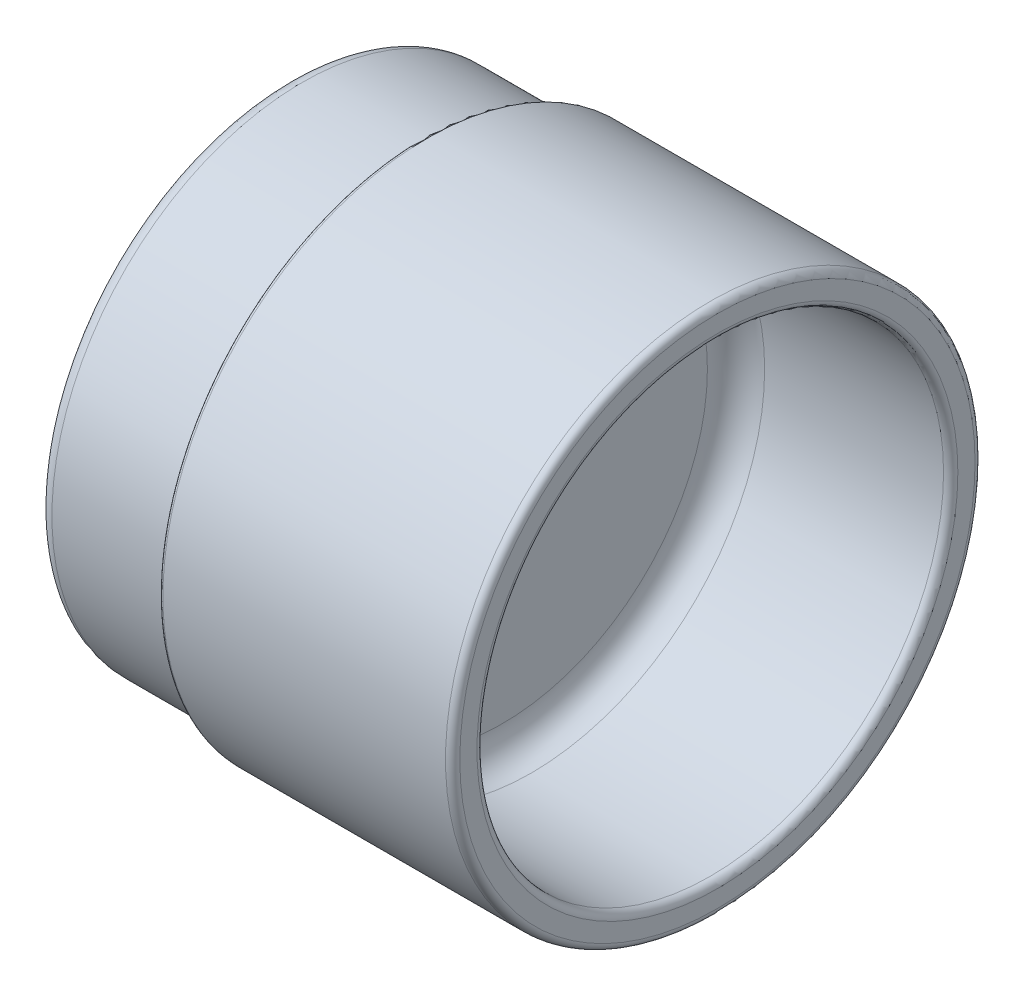
ISO-10303-21;
HEADER;
FILE_DESCRIPTION(('STEP AP214'),'2;1');
FILE_NAME('part.step','',(''),(''),'','','');
FILE_SCHEMA(('AUTOMOTIVE_DESIGN { 1 0 10303 214 1 1 1 1 }'));
ENDSEC;
DATA;
#1=APPLICATION_CONTEXT('core data for automotive mechanical design processes');
#2=APPLICATION_PROTOCOL_DEFINITION('international standard','automotive_design',2000,#1);
#3=PRODUCT_CONTEXT('',#1,'mechanical');
#4=PRODUCT('Part','Part','',(#3));
#5=PRODUCT_RELATED_PRODUCT_CATEGORY('part','',(#4));
#6=PRODUCT_DEFINITION_FORMATION('','',#4);
#7=PRODUCT_DEFINITION_CONTEXT('part definition',#1,'design');
#8=PRODUCT_DEFINITION('design','',#6,#7);
#9=PRODUCT_DEFINITION_SHAPE('','',#8);
#10=(LENGTH_UNIT() NAMED_UNIT(*) SI_UNIT(.MILLI.,.METRE.));
#11=(NAMED_UNIT(*) PLANE_ANGLE_UNIT() SI_UNIT($,.RADIAN.));
#12=(NAMED_UNIT(*) SI_UNIT($,.STERADIAN.) SOLID_ANGLE_UNIT());
#13=UNCERTAINTY_MEASURE_WITH_UNIT(LENGTH_MEASURE(1.E-05),#10,'distance_accuracy_value','');
#14=(GEOMETRIC_REPRESENTATION_CONTEXT(3) GLOBAL_UNCERTAINTY_ASSIGNED_CONTEXT((#13)) GLOBAL_UNIT_ASSIGNED_CONTEXT((#10,
#11,#12)) REPRESENTATION_CONTEXT('',''));
#15=CARTESIAN_POINT('',(0.,0.,0.));
#16=DIRECTION('',(0.,0.,1.));
#17=DIRECTION('',(1.,0.,0.));
#18=AXIS2_PLACEMENT_3D('',#15,#16,#17);
#19=CARTESIAN_POINT('',(0.,0.,0.));
#20=DIRECTION('',(-1.,0.,0.));
#21=DIRECTION('',(0.,0.,1.));
#22=AXIS2_PLACEMENT_3D('',#19,#20,#21);
#23=PLANE('',#22);
#24=CARTESIAN_POINT('',(0.,0.,0.));
#25=DIRECTION('',(1.,0.,0.));
#26=DIRECTION('',(0.,0.,-1.));
#27=AXIS2_PLACEMENT_3D('',#24,#25,#26);
#28=CIRCLE('',#27,33.);
#29=CARTESIAN_POINT('',(0.,0.,-33.));
#30=VERTEX_POINT('',#29);
#31=EDGE_CURVE('E10',#30,#30,#28,.T.);
#32=ORIENTED_EDGE('',*,*,#31,.F.);
#33=EDGE_LOOP('',(#32));
#34=FACE_BOUND('',#33,.T.);
#35=ADVANCED_FACE('F43',(#34),#23,.T.);
#36=CARTESIAN_POINT('',(2.,0.,0.));
#37=DIRECTION('',(1.,0.,0.));
#38=DIRECTION('',(0.,0.,-1.));
#39=AXIS2_PLACEMENT_3D('',#36,#37,#38);
#40=TOROIDAL_SURFACE('',#39,33.,2.);
#41=ORIENTED_EDGE('',*,*,#31,.T.);
#42=EDGE_LOOP('',(#41));
#43=FACE_BOUND('',#42,.T.);
#44=CARTESIAN_POINT('',(2.,0.,0.));
#45=DIRECTION('',(1.,0.,0.));
#46=DIRECTION('',(0.,0.,-1.));
#47=AXIS2_PLACEMENT_3D('',#44,#45,#46);
#48=CIRCLE('',#47,35.);
#49=CARTESIAN_POINT('',(2.,0.,-35.));
#50=VERTEX_POINT('',#49);
#51=EDGE_CURVE('E50',#50,#50,#48,.T.);
#52=ORIENTED_EDGE('',*,*,#51,.F.);
#53=EDGE_LOOP('',(#52));
#54=FACE_BOUND('',#53,.T.);
#55=ADVANCED_FACE('F111',(#43,#54),#40,.T.);
#56=CARTESIAN_POINT('',(30.,0.,0.));
#57=DIRECTION('',(1.,0.,0.));
#58=DIRECTION('',(0.,0.,-1.));
#59=AXIS2_PLACEMENT_3D('',#56,#57,#58);
#60=CYLINDRICAL_SURFACE('',#59,35.);
#61=ORIENTED_EDGE('',*,*,#51,.T.);
#62=EDGE_LOOP('',(#61));
#63=FACE_BOUND('',#62,.T.);
#64=CARTESIAN_POINT('',(19.,0.,0.));
#65=DIRECTION('',(1.,0.,0.));
#66=DIRECTION('',(0.,0.,-1.));
#67=AXIS2_PLACEMENT_3D('',#64,#65,#66);
#68=CIRCLE('',#67,35.);
#69=CARTESIAN_POINT('',(19.,0.,-35.));
#70=VERTEX_POINT('',#69);
#71=EDGE_CURVE('E55',#70,#70,#68,.T.);
#72=ORIENTED_EDGE('',*,*,#71,.F.);
#73=EDGE_LOOP('',(#72));
#74=FACE_BOUND('',#73,.T.);
#75=ADVANCED_FACE('F116',(#63,#74),#60,.T.);
#76=CARTESIAN_POINT('',(19.,0.,-35.));
#77=DIRECTION('',(-1.,0.,0.));
#78=DIRECTION('',(0.,0.,1.));
#79=AXIS2_PLACEMENT_3D('',#76,#77,#78);
#80=PLANE('',#79);
#81=ORIENTED_EDGE('',*,*,#71,.T.);
#82=EDGE_LOOP('',(#81));
#83=FACE_BOUND('',#82,.T.);
#84=CARTESIAN_POINT('',(19.,0.,0.));
#85=DIRECTION('',(1.,0.,0.));
#86=DIRECTION('',(0.,0.,-1.));
#87=AXIS2_PLACEMENT_3D('',#84,#85,#86);
#88=CIRCLE('',#87,36.5);
#89=CARTESIAN_POINT('',(19.,0.,-36.5));
#90=VERTEX_POINT('',#89);
#91=EDGE_CURVE('E60',#90,#90,#88,.T.);
#92=ORIENTED_EDGE('',*,*,#91,.F.);
#93=EDGE_LOOP('',(#92));
#94=FACE_BOUND('',#93,.T.);
#95=ADVANCED_FACE('F120',(#83,#94),#80,.T.);
#96=CARTESIAN_POINT('',(19.5,0.,0.));
#97=DIRECTION('',(1.,0.,0.));
#98=DIRECTION('',(0.,0.,-1.));
#99=AXIS2_PLACEMENT_3D('',#96,#97,#98);
#100=TOROIDAL_SURFACE('',#99,36.5,0.5);
#101=ORIENTED_EDGE('',*,*,#91,.T.);
#102=EDGE_LOOP('',(#101));
#103=FACE_BOUND('',#102,.T.);
#104=CARTESIAN_POINT('',(19.5,0.,0.));
#105=DIRECTION('',(1.,0.,0.));
#106=DIRECTION('',(0.,0.,-1.));
#107=AXIS2_PLACEMENT_3D('',#104,#105,#106);
#108=CIRCLE('',#107,37.);
#109=CARTESIAN_POINT('',(19.5,0.,-37.));
#110=VERTEX_POINT('',#109);
#111=EDGE_CURVE('E66',#110,#110,#108,.T.);
#112=ORIENTED_EDGE('',*,*,#111,.F.);
#113=EDGE_LOOP('',(#112));
#114=FACE_BOUND('',#113,.T.);
#115=ADVANCED_FACE('F126',(#103,#114),#100,.T.);
#116=CARTESIAN_POINT('',(30.,0.,0.));
#117=DIRECTION('',(1.,0.,0.));
#118=DIRECTION('',(0.,0.,-1.));
#119=AXIS2_PLACEMENT_3D('',#116,#117,#118);
#120=CYLINDRICAL_SURFACE('',#119,37.);
#121=ORIENTED_EDGE('',*,*,#111,.T.);
#122=EDGE_LOOP('',(#121));
#123=FACE_BOUND('',#122,.T.);
#124=CARTESIAN_POINT('',(59.,0.,0.));
#125=DIRECTION('',(1.,0.,0.));
#126=DIRECTION('',(0.,0.,-1.));
#127=AXIS2_PLACEMENT_3D('',#124,#125,#126);
#128=CIRCLE('',#127,37.);
#129=CARTESIAN_POINT('',(59.,0.,-37.));
#130=VERTEX_POINT('',#129);
#131=EDGE_CURVE('E70',#130,#130,#128,.T.);
#132=ORIENTED_EDGE('',*,*,#131,.F.);
#133=EDGE_LOOP('',(#132));
#134=FACE_BOUND('',#133,.T.);
#135=ADVANCED_FACE('F130',(#123,#134),#120,.T.);
#136=CARTESIAN_POINT('',(59.,0.,0.));
#137=DIRECTION('',(1.,0.,0.));
#138=DIRECTION('',(0.,0.,-1.));
#139=AXIS2_PLACEMENT_3D('',#136,#137,#138);
#140=TOROIDAL_SURFACE('',#139,36.,0.999999999999997);
#141=ORIENTED_EDGE('',*,*,#131,.T.);
#142=EDGE_LOOP('',(#141));
#143=FACE_BOUND('',#142,.T.);
#144=CARTESIAN_POINT('',(60.,0.,0.));
#145=DIRECTION('',(1.,0.,0.));
#146=DIRECTION('',(0.,0.,-1.));
#147=AXIS2_PLACEMENT_3D('',#144,#145,#146);
#148=CIRCLE('',#147,36.);
#149=CARTESIAN_POINT('',(60.,0.,-36.));
#150=VERTEX_POINT('',#149);
#151=EDGE_CURVE('E74',#150,#150,#148,.T.);
#152=ORIENTED_EDGE('',*,*,#151,.F.);
#153=EDGE_LOOP('',(#152));
#154=FACE_BOUND('',#153,.T.);
#155=ADVANCED_FACE('F134',(#143,#154),#140,.T.);
#156=CARTESIAN_POINT('',(60.,0.,-36.));
#157=DIRECTION('',(1.,0.,0.));
#158=DIRECTION('',(0.,0.,-1.));
#159=AXIS2_PLACEMENT_3D('',#156,#157,#158);
#160=PLANE('',#159);
#161=ORIENTED_EDGE('',*,*,#151,.T.);
#162=EDGE_LOOP('',(#161));
#163=FACE_BOUND('',#162,.T.);
#164=CARTESIAN_POINT('',(60.,0.,0.));
#165=DIRECTION('',(1.,0.,0.));
#166=DIRECTION('',(0.,0.,-1.));
#167=AXIS2_PLACEMENT_3D('',#164,#165,#166);
#168=CIRCLE('',#167,33.6);
#169=CARTESIAN_POINT('',(60.,0.,-33.6));
#170=VERTEX_POINT('',#169);
#171=EDGE_CURVE('E78',#170,#170,#168,.T.);
#172=ORIENTED_EDGE('',*,*,#171,.F.);
#173=EDGE_LOOP('',(#172));
#174=FACE_BOUND('',#173,.T.);
#175=ADVANCED_FACE('F138',(#163,#174),#160,.T.);
#176=CARTESIAN_POINT('',(59.,0.,0.));
#177=DIRECTION('',(1.,0.,0.));
#178=DIRECTION('',(0.,0.,-1.));
#179=AXIS2_PLACEMENT_3D('',#176,#177,#178);
#180=TOROIDAL_SURFACE('',#179,33.6,1.);
#181=ORIENTED_EDGE('',*,*,#171,.T.);
#182=EDGE_LOOP('',(#181));
#183=FACE_BOUND('',#182,.T.);
#184=CARTESIAN_POINT('',(59.,0.,0.));
#185=DIRECTION('',(1.,0.,0.));
#186=DIRECTION('',(0.,0.,-1.));
#187=AXIS2_PLACEMENT_3D('',#184,#185,#186);
#188=CIRCLE('',#187,32.6);
#189=CARTESIAN_POINT('',(59.,0.,-32.6));
#190=VERTEX_POINT('',#189);
#191=EDGE_CURVE('E82',#190,#190,#188,.T.);
#192=ORIENTED_EDGE('',*,*,#191,.F.);
#193=EDGE_LOOP('',(#192));
#194=FACE_BOUND('',#193,.T.);
#195=ADVANCED_FACE('F107',(#183,#194),#180,.T.);
#196=CARTESIAN_POINT('',(30.,0.,0.));
#197=DIRECTION('',(1.,0.,0.));
#198=DIRECTION('',(0.,0.,-1.));
#199=AXIS2_PLACEMENT_3D('',#196,#197,#198);
#200=CYLINDRICAL_SURFACE('',#199,32.6);
#201=ORIENTED_EDGE('',*,*,#191,.T.);
#202=EDGE_LOOP('',(#201));
#203=FACE_BOUND('',#202,.T.);
#204=CARTESIAN_POINT('',(34.,0.,0.));
#205=DIRECTION('',(1.,0.,0.));
#206=DIRECTION('',(0.,0.,-1.));
#207=AXIS2_PLACEMENT_3D('',#204,#205,#206);
#208=CIRCLE('',#207,32.6);
#209=CARTESIAN_POINT('',(34.,0.,-32.6));
#210=VERTEX_POINT('',#209);
#211=EDGE_CURVE('E86',#210,#210,#208,.T.);
#212=ORIENTED_EDGE('',*,*,#211,.F.);
#213=EDGE_LOOP('',(#212));
#214=FACE_BOUND('',#213,.T.);
#215=ADVANCED_FACE('F99',(#203,#214),#200,.F.);
#216=CARTESIAN_POINT('',(34.,0.,0.));
#217=DIRECTION('',(1.,0.,0.));
#218=DIRECTION('',(0.,0.,-1.));
#219=AXIS2_PLACEMENT_3D('',#216,#217,#218);
#220=TOROIDAL_SURFACE('',#219,28.6,4.);
#221=ORIENTED_EDGE('',*,*,#211,.T.);
#222=EDGE_LOOP('',(#221));
#223=FACE_BOUND('',#222,.T.);
#224=CARTESIAN_POINT('',(30.,0.,0.));
#225=DIRECTION('',(1.,0.,0.));
#226=DIRECTION('',(0.,0.,-1.));
#227=AXIS2_PLACEMENT_3D('',#224,#225,#226);
#228=CIRCLE('',#227,28.6);
#229=CARTESIAN_POINT('',(30.,0.,-28.6));
#230=VERTEX_POINT('',#229);
#231=EDGE_CURVE('E90',#230,#230,#228,.T.);
#232=ORIENTED_EDGE('',*,*,#231,.F.);
#233=EDGE_LOOP('',(#232));
#234=FACE_BOUND('',#233,.T.);
#235=ADVANCED_FACE('F97',(#223,#234),#220,.F.);
#236=CARTESIAN_POINT('',(30.,0.,-28.6));
#237=DIRECTION('',(1.,0.,0.));
#238=DIRECTION('',(0.,0.,-1.));
#239=AXIS2_PLACEMENT_3D('',#236,#237,#238);
#240=PLANE('',#239);
#241=ORIENTED_EDGE('',*,*,#231,.T.);
#242=EDGE_LOOP('',(#241));
#243=FACE_BOUND('',#242,.T.);
#244=ADVANCED_FACE('F95',(#243),#240,.T.);
#245=CLOSED_SHELL('',(#35,#55,#75,#95,#115,#135,#155,#175,#195,#215,#235,#244));
#246=MANIFOLD_SOLID_BREP('B2',#245);
#247=ADVANCED_BREP_SHAPE_REPRESENTATION('',(#18,#246),#14);
#248=SHAPE_DEFINITION_REPRESENTATION(#9,#247);
ENDSEC;
END-ISO-10303-21;
